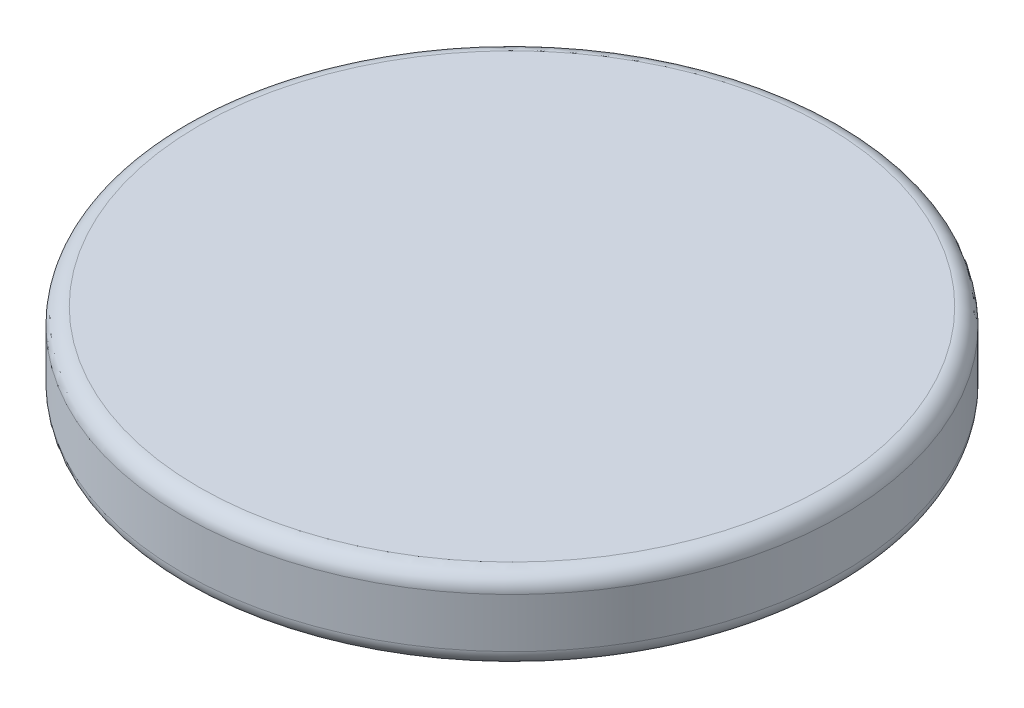
ISO-10303-21;
HEADER;
FILE_DESCRIPTION(('STEP AP214'),'2;1');
FILE_NAME('part.step','',(''),(''),'','','');
FILE_SCHEMA(('AUTOMOTIVE_DESIGN { 1 0 10303 214 1 1 1 1 }'));
ENDSEC;
DATA;
#1=APPLICATION_CONTEXT('core data for automotive mechanical design processes');
#2=APPLICATION_PROTOCOL_DEFINITION('international standard','automotive_design',2000,#1);
#3=PRODUCT_CONTEXT('',#1,'mechanical');
#4=PRODUCT('Part','Part','',(#3));
#5=PRODUCT_RELATED_PRODUCT_CATEGORY('part','',(#4));
#6=PRODUCT_DEFINITION_FORMATION('','',#4);
#7=PRODUCT_DEFINITION_CONTEXT('part definition',#1,'design');
#8=PRODUCT_DEFINITION('design','',#6,#7);
#9=PRODUCT_DEFINITION_SHAPE('','',#8);
#10=(LENGTH_UNIT() NAMED_UNIT(*) SI_UNIT(.MILLI.,.METRE.));
#11=(NAMED_UNIT(*) PLANE_ANGLE_UNIT() SI_UNIT($,.RADIAN.));
#12=(NAMED_UNIT(*) SI_UNIT($,.STERADIAN.) SOLID_ANGLE_UNIT());
#13=UNCERTAINTY_MEASURE_WITH_UNIT(LENGTH_MEASURE(1.E-05),#10,'distance_accuracy_value','');
#14=(GEOMETRIC_REPRESENTATION_CONTEXT(3) GLOBAL_UNCERTAINTY_ASSIGNED_CONTEXT((#13)) GLOBAL_UNIT_ASSIGNED_CONTEXT((#10,
#11,#12)) REPRESENTATION_CONTEXT('',''));
#15=CARTESIAN_POINT('',(0.,0.,0.));
#16=DIRECTION('',(0.,0.,1.));
#17=DIRECTION('',(1.,0.,0.));
#18=AXIS2_PLACEMENT_3D('',#15,#16,#17);
#19=CARTESIAN_POINT('',(0.,1.,0.));
#20=DIRECTION('',(0.,-1.,0.));
#21=DIRECTION('',(0.,0.,-1.));
#22=AXIS2_PLACEMENT_3D('',#19,#20,#21);
#23=CYLINDRICAL_SURFACE('',#22,4.);
#24=CARTESIAN_POINT('',(0.,0.2,0.));
#25=DIRECTION('',(0.,1.,0.));
#26=DIRECTION('',(0.,0.,1.));
#27=AXIS2_PLACEMENT_3D('',#24,#25,#26);
#28=CIRCLE('',#27,4.);
#29=CARTESIAN_POINT('',(0.,0.2,4.));
#30=VERTEX_POINT('',#29);
#31=EDGE_CURVE('E44',#30,#30,#28,.T.);
#32=ORIENTED_EDGE('',*,*,#31,.T.);
#33=EDGE_LOOP('',(#32));
#34=FACE_BOUND('',#33,.T.);
#35=CARTESIAN_POINT('',(0.,0.8,0.));
#36=DIRECTION('',(0.,1.,0.));
#37=DIRECTION('',(0.,0.,1.));
#38=AXIS2_PLACEMENT_3D('',#35,#36,#37);
#39=CIRCLE('',#38,4.);
#40=CARTESIAN_POINT('',(0.,0.8,4.));
#41=VERTEX_POINT('',#40);
#42=EDGE_CURVE('E48',#41,#41,#39,.F.);
#43=ORIENTED_EDGE('',*,*,#42,.T.);
#44=EDGE_LOOP('',(#43));
#45=FACE_BOUND('',#44,.T.);
#46=ADVANCED_FACE('F33',(#34,#45),#23,.T.);
#47=CARTESIAN_POINT('',(0.,1.,0.));
#48=DIRECTION('',(0.,1.,0.));
#49=DIRECTION('',(0.,0.,1.));
#50=AXIS2_PLACEMENT_3D('',#47,#48,#49);
#51=PLANE('',#50);
#52=CARTESIAN_POINT('',(0.,1.,0.));
#53=DIRECTION('',(0.,1.,0.));
#54=DIRECTION('',(0.,0.,1.));
#55=AXIS2_PLACEMENT_3D('',#52,#53,#54);
#56=CIRCLE('',#55,3.8);
#57=CARTESIAN_POINT('',(0.,1.,3.8));
#58=VERTEX_POINT('',#57);
#59=EDGE_CURVE('E10',#58,#58,#56,.T.);
#60=ORIENTED_EDGE('',*,*,#59,.T.);
#61=EDGE_LOOP('',(#60));
#62=FACE_BOUND('',#61,.T.);
#63=ADVANCED_FACE('F64',(#62),#51,.T.);
#64=CARTESIAN_POINT('',(0.,0.,0.));
#65=DIRECTION('',(0.,1.,0.));
#66=DIRECTION('',(0.,0.,1.));
#67=AXIS2_PLACEMENT_3D('',#64,#65,#66);
#68=PLANE('',#67);
#69=CARTESIAN_POINT('',(0.,0.,0.));
#70=DIRECTION('',(0.,1.,0.));
#71=DIRECTION('',(0.,0.,1.));
#72=AXIS2_PLACEMENT_3D('',#69,#70,#71);
#73=CIRCLE('',#72,3.8);
#74=CARTESIAN_POINT('',(0.,0.,3.8));
#75=VERTEX_POINT('',#74);
#76=EDGE_CURVE('E40',#75,#75,#73,.F.);
#77=ORIENTED_EDGE('',*,*,#76,.T.);
#78=EDGE_LOOP('',(#77));
#79=FACE_BOUND('',#78,.T.);
#80=ADVANCED_FACE('F61',(#79),#68,.F.);
#81=CARTESIAN_POINT('',(0.,0.2,0.));
#82=DIRECTION('',(0.,1.,0.));
#83=DIRECTION('',(0.,0.,1.));
#84=AXIS2_PLACEMENT_3D('',#81,#82,#83);
#85=TOROIDAL_SURFACE('',#84,3.8,0.2);
#86=ORIENTED_EDGE('',*,*,#76,.F.);
#87=EDGE_LOOP('',(#86));
#88=FACE_BOUND('',#87,.T.);
#89=ORIENTED_EDGE('',*,*,#31,.F.);
#90=EDGE_LOOP('',(#89));
#91=FACE_BOUND('',#90,.T.);
#92=ADVANCED_FACE('F57',(#88,#91),#85,.T.);
#93=CARTESIAN_POINT('',(0.,0.8,0.));
#94=DIRECTION('',(0.,1.,0.));
#95=DIRECTION('',(0.,0.,1.));
#96=AXIS2_PLACEMENT_3D('',#93,#94,#95);
#97=TOROIDAL_SURFACE('',#96,3.8,0.2);
#98=ORIENTED_EDGE('',*,*,#42,.F.);
#99=EDGE_LOOP('',(#98));
#100=FACE_BOUND('',#99,.T.);
#101=ORIENTED_EDGE('',*,*,#59,.F.);
#102=EDGE_LOOP('',(#101));
#103=FACE_BOUND('',#102,.T.);
#104=ADVANCED_FACE('F35',(#100,#103),#97,.T.);
#105=CLOSED_SHELL('',(#46,#63,#80,#92,#104));
#106=MANIFOLD_SOLID_BREP('B2',#105);
#107=ADVANCED_BREP_SHAPE_REPRESENTATION('',(#18,#106),#14);
#108=SHAPE_DEFINITION_REPRESENTATION(#9,#107);
ENDSEC;
END-ISO-10303-21;
